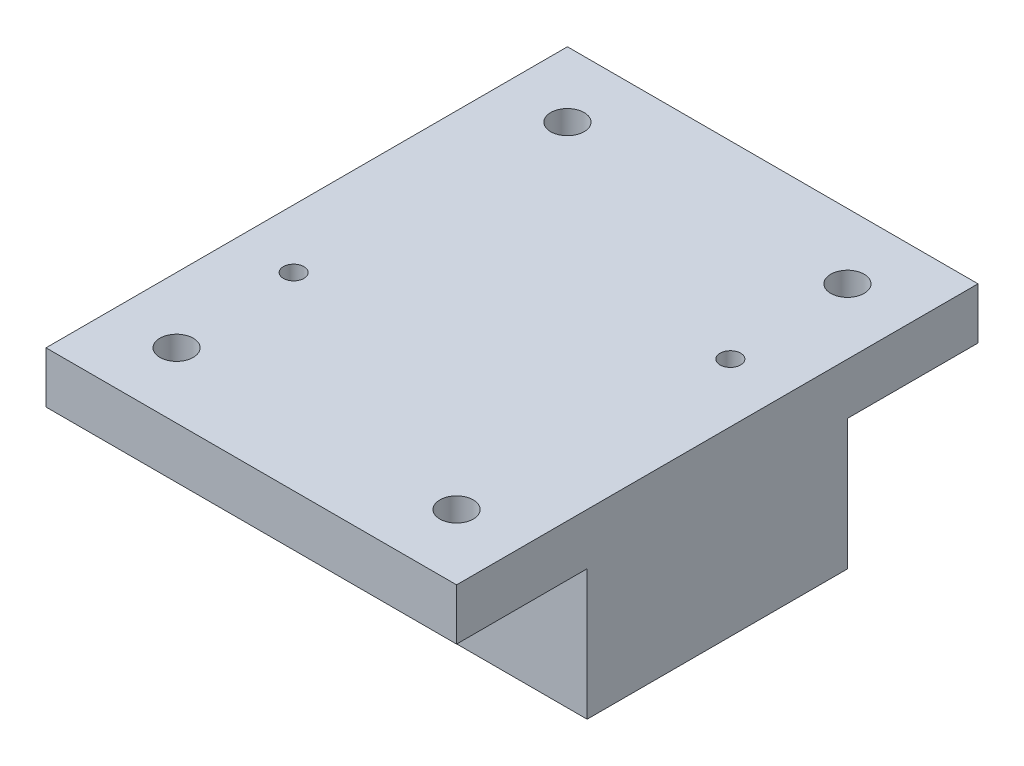
ISO-10303-21;
HEADER;
FILE_DESCRIPTION(('STEP AP214'),'2;1');
FILE_NAME('part.step','',(''),(''),'','','');
FILE_SCHEMA(('AUTOMOTIVE_DESIGN { 1 0 10303 214 1 1 1 1 }'));
ENDSEC;
DATA;
#1=APPLICATION_CONTEXT('core data for automotive mechanical design processes');
#2=APPLICATION_PROTOCOL_DEFINITION('international standard','automotive_design',2000,#1);
#3=PRODUCT_CONTEXT('',#1,'mechanical');
#4=PRODUCT('Part','Part','',(#3));
#5=PRODUCT_RELATED_PRODUCT_CATEGORY('part','',(#4));
#6=PRODUCT_DEFINITION_FORMATION('','',#4);
#7=PRODUCT_DEFINITION_CONTEXT('part definition',#1,'design');
#8=PRODUCT_DEFINITION('design','',#6,#7);
#9=PRODUCT_DEFINITION_SHAPE('','',#8);
#10=(LENGTH_UNIT() NAMED_UNIT(*) SI_UNIT(.MILLI.,.METRE.));
#11=(NAMED_UNIT(*) PLANE_ANGLE_UNIT() SI_UNIT($,.RADIAN.));
#12=(NAMED_UNIT(*) SI_UNIT($,.STERADIAN.) SOLID_ANGLE_UNIT());
#13=UNCERTAINTY_MEASURE_WITH_UNIT(LENGTH_MEASURE(1.E-05),#10,'distance_accuracy_value','');
#14=(GEOMETRIC_REPRESENTATION_CONTEXT(3) GLOBAL_UNCERTAINTY_ASSIGNED_CONTEXT((#13)) GLOBAL_UNIT_ASSIGNED_CONTEXT((#10,
#11,#12)) REPRESENTATION_CONTEXT('',''));
#15=CARTESIAN_POINT('',(0.,0.,0.));
#16=DIRECTION('',(0.,0.,1.));
#17=DIRECTION('',(1.,0.,0.));
#18=AXIS2_PLACEMENT_3D('',#15,#16,#17);
#19=CARTESIAN_POINT('',(0.,0.,0.));
#20=DIRECTION('',(0.,1.,0.));
#21=DIRECTION('',(0.,0.,1.));
#22=AXIS2_PLACEMENT_3D('',#19,#20,#21);
#23=PLANE('',#22);
#24=CARTESIAN_POINT('',(-27.28125,0.,-38.08125));
#25=DIRECTION('',(0.,1.,0.));
#26=DIRECTION('',(0.,0.,1.));
#27=AXIS2_PLACEMENT_3D('',#24,#25,#26);
#28=CIRCLE('',#27,3.25);
#29=CARTESIAN_POINT('',(-27.28125,0.,-34.83125));
#30=VERTEX_POINT('',#29);
#31=EDGE_CURVE('E176',#30,#30,#28,.T.);
#32=ORIENTED_EDGE('',*,*,#31,.T.);
#33=EDGE_LOOP('',(#32));
#34=FACE_BOUND('',#33,.T.);
#35=CARTESIAN_POINT('',(27.28125,0.,-38.08125));
#36=DIRECTION('',(0.,1.,0.));
#37=DIRECTION('',(0.,0.,1.));
#38=AXIS2_PLACEMENT_3D('',#35,#36,#37);
#39=CIRCLE('',#38,3.25);
#40=CARTESIAN_POINT('',(27.28125,0.,-34.83125));
#41=VERTEX_POINT('',#40);
#42=EDGE_CURVE('E173',#41,#41,#39,.T.);
#43=ORIENTED_EDGE('',*,*,#42,.T.);
#44=EDGE_LOOP('',(#43));
#45=FACE_BOUND('',#44,.T.);
#46=DIRECTION('',(1.,0.,0.));
#47=VECTOR('',#46,1.);
#48=CARTESIAN_POINT('',(0.,0.,-25.3625));
#49=LINE('',#48,#47);
#50=CARTESIAN_POINT('',(-40.,0.,-25.3625));
#51=VERTEX_POINT('',#50);
#52=CARTESIAN_POINT('',(40.,0.,-25.3625));
#53=VERTEX_POINT('',#52);
#54=EDGE_CURVE('E58',#51,#53,#49,.T.);
#55=ORIENTED_EDGE('',*,*,#54,.F.);
#56=DIRECTION('',(0.,0.,-1.));
#57=VECTOR('',#56,1.);
#58=CARTESIAN_POINT('',(-40.,0.,0.));
#59=LINE('',#58,#57);
#60=CARTESIAN_POINT('',(-40.,0.,-50.8));
#61=VERTEX_POINT('',#60);
#62=EDGE_CURVE('E135',#51,#61,#59,.T.);
#63=ORIENTED_EDGE('',*,*,#62,.T.);
#64=DIRECTION('',(1.,0.,0.));
#65=VECTOR('',#64,1.);
#66=CARTESIAN_POINT('',(0.,0.,-50.8));
#67=LINE('',#66,#65);
#68=CARTESIAN_POINT('',(40.,0.,-50.8));
#69=VERTEX_POINT('',#68);
#70=EDGE_CURVE('E170',#61,#69,#67,.T.);
#71=ORIENTED_EDGE('',*,*,#70,.T.);
#72=DIRECTION('',(0.,0.,-1.));
#73=VECTOR('',#72,1.);
#74=CARTESIAN_POINT('',(40.,0.,0.));
#75=LINE('',#74,#73);
#76=EDGE_CURVE('E168',#53,#69,#75,.T.);
#77=ORIENTED_EDGE('',*,*,#76,.F.);
#78=EDGE_LOOP('',(#55,#63,#71,#77));
#79=FACE_BOUND('',#78,.T.);
#80=ADVANCED_FACE('F35',(#34,#45,#79),#23,.F.);
#81=CARTESIAN_POINT('',(-40.,10.,0.));
#82=DIRECTION('',(-1.,0.,0.));
#83=DIRECTION('',(0.,0.,1.));
#84=AXIS2_PLACEMENT_3D('',#81,#82,#83);
#85=PLANE('',#84);
#86=CARTESIAN_POINT('',(-40.,0.,50.8));
#87=VERTEX_POINT('',#86);
#88=CARTESIAN_POINT('',(-40.,0.,25.3625));
#89=VERTEX_POINT('',#88);
#90=EDGE_CURVE('E164',#87,#89,#59,.T.);
#91=ORIENTED_EDGE('',*,*,#90,.F.);
#92=DIRECTION('',(0.,-1.,0.));
#93=VECTOR('',#92,1.);
#94=CARTESIAN_POINT('',(-40.,10.,50.8));
#95=LINE('',#94,#93);
#96=CARTESIAN_POINT('',(-40.,10.,50.8));
#97=VERTEX_POINT('',#96);
#98=EDGE_CURVE('E11',#97,#87,#95,.T.);
#99=ORIENTED_EDGE('',*,*,#98,.F.);
#100=DIRECTION('',(0.,0.,-1.));
#101=VECTOR('',#100,1.);
#102=CARTESIAN_POINT('',(-40.,10.,0.));
#103=LINE('',#102,#101);
#104=CARTESIAN_POINT('',(-40.,10.,-50.8));
#105=VERTEX_POINT('',#104);
#106=EDGE_CURVE('E140',#97,#105,#103,.T.);
#107=ORIENTED_EDGE('',*,*,#106,.T.);
#108=DIRECTION('',(0.,-1.,0.));
#109=VECTOR('',#108,1.);
#110=CARTESIAN_POINT('',(-40.,10.,-50.8));
#111=LINE('',#110,#109);
#112=EDGE_CURVE('E163',#105,#61,#111,.T.);
#113=ORIENTED_EDGE('',*,*,#112,.T.);
#114=ORIENTED_EDGE('',*,*,#62,.F.);
#115=DIRECTION('',(0.,1.,0.));
#116=VECTOR('',#115,1.);
#117=CARTESIAN_POINT('',(-40.,-25.4,-25.3625));
#118=LINE('',#117,#116);
#119=CARTESIAN_POINT('',(-40.,-25.4,-25.3625));
#120=VERTEX_POINT('',#119);
#121=EDGE_CURVE('E136',#120,#51,#118,.T.);
#122=ORIENTED_EDGE('',*,*,#121,.F.);
#123=DIRECTION('',(0.,0.,-1.));
#124=VECTOR('',#123,1.);
#125=CARTESIAN_POINT('',(-40.,-25.4,0.));
#126=LINE('',#125,#124);
#127=CARTESIAN_POINT('',(-40.,-25.4,25.3625));
#128=VERTEX_POINT('',#127);
#129=EDGE_CURVE('E110',#128,#120,#126,.T.);
#130=ORIENTED_EDGE('',*,*,#129,.F.);
#131=DIRECTION('',(0.,1.,0.));
#132=VECTOR('',#131,1.);
#133=CARTESIAN_POINT('',(-40.,-25.4,25.3625));
#134=LINE('',#133,#132);
#135=EDGE_CURVE('E122',#128,#89,#134,.T.);
#136=ORIENTED_EDGE('',*,*,#135,.T.);
#137=EDGE_LOOP('',(#91,#99,#107,#113,#114,#122,#130,#136));
#138=FACE_BOUND('',#137,.T.);
#139=ADVANCED_FACE('F37',(#138),#85,.T.);
#140=CARTESIAN_POINT('',(0.,10.,50.8));
#141=DIRECTION('',(0.,0.,-1.));
#142=DIRECTION('',(-1.,0.,0.));
#143=AXIS2_PLACEMENT_3D('',#140,#141,#142);
#144=PLANE('',#143);
#145=DIRECTION('',(1.,0.,0.));
#146=VECTOR('',#145,1.);
#147=CARTESIAN_POINT('',(0.,0.,50.8));
#148=LINE('',#147,#146);
#149=CARTESIAN_POINT('',(40.,0.,50.8));
#150=VERTEX_POINT('',#149);
#151=EDGE_CURVE('E166',#87,#150,#148,.T.);
#152=ORIENTED_EDGE('',*,*,#151,.T.);
#153=DIRECTION('',(0.,-1.,0.));
#154=VECTOR('',#153,1.);
#155=CARTESIAN_POINT('',(40.,10.,50.8));
#156=LINE('',#155,#154);
#157=CARTESIAN_POINT('',(40.,10.,50.8));
#158=VERTEX_POINT('',#157);
#159=EDGE_CURVE('E43',#158,#150,#156,.T.);
#160=ORIENTED_EDGE('',*,*,#159,.F.);
#161=DIRECTION('',(1.,0.,0.));
#162=VECTOR('',#161,1.);
#163=CARTESIAN_POINT('',(0.,10.,50.8));
#164=LINE('',#163,#162);
#165=EDGE_CURVE('E143',#97,#158,#164,.T.);
#166=ORIENTED_EDGE('',*,*,#165,.F.);
#167=ORIENTED_EDGE('',*,*,#98,.T.);
#168=EDGE_LOOP('',(#152,#160,#166,#167));
#169=FACE_BOUND('',#168,.T.);
#170=ADVANCED_FACE('F209',(#169),#144,.F.);
#171=CARTESIAN_POINT('',(40.,10.,0.));
#172=DIRECTION('',(-1.,0.,0.));
#173=DIRECTION('',(0.,0.,1.));
#174=AXIS2_PLACEMENT_3D('',#171,#172,#173);
#175=PLANE('',#174);
#176=CARTESIAN_POINT('',(40.,0.,25.3625));
#177=VERTEX_POINT('',#176);
#178=EDGE_CURVE('E106',#150,#177,#75,.T.);
#179=ORIENTED_EDGE('',*,*,#178,.T.);
#180=DIRECTION('',(0.,1.,0.));
#181=VECTOR('',#180,1.);
#182=CARTESIAN_POINT('',(40.,-25.4,25.3625));
#183=LINE('',#182,#181);
#184=CARTESIAN_POINT('',(40.,-25.4,25.3625));
#185=VERTEX_POINT('',#184);
#186=EDGE_CURVE('E100',#185,#177,#183,.T.);
#187=ORIENTED_EDGE('',*,*,#186,.F.);
#188=DIRECTION('',(0.,0.,-1.));
#189=VECTOR('',#188,1.);
#190=CARTESIAN_POINT('',(40.,-25.4,0.));
#191=LINE('',#190,#189);
#192=CARTESIAN_POINT('',(40.,-25.4,-25.3625));
#193=VERTEX_POINT('',#192);
#194=EDGE_CURVE('E104',#185,#193,#191,.T.);
#195=ORIENTED_EDGE('',*,*,#194,.T.);
#196=DIRECTION('',(0.,1.,0.));
#197=VECTOR('',#196,1.);
#198=CARTESIAN_POINT('',(40.,-25.4,-25.3625));
#199=LINE('',#198,#197);
#200=EDGE_CURVE('E109',#193,#53,#199,.T.);
#201=ORIENTED_EDGE('',*,*,#200,.T.);
#202=ORIENTED_EDGE('',*,*,#76,.T.);
#203=DIRECTION('',(0.,-1.,0.));
#204=VECTOR('',#203,1.);
#205=CARTESIAN_POINT('',(40.,10.,-50.8));
#206=LINE('',#205,#204);
#207=CARTESIAN_POINT('',(40.,10.,-50.8));
#208=VERTEX_POINT('',#207);
#209=EDGE_CURVE('E186',#208,#69,#206,.T.);
#210=ORIENTED_EDGE('',*,*,#209,.F.);
#211=DIRECTION('',(0.,0.,-1.));
#212=VECTOR('',#211,1.);
#213=CARTESIAN_POINT('',(40.,10.,0.));
#214=LINE('',#213,#212);
#215=EDGE_CURVE('E146',#158,#208,#214,.T.);
#216=ORIENTED_EDGE('',*,*,#215,.F.);
#217=ORIENTED_EDGE('',*,*,#159,.T.);
#218=EDGE_LOOP('',(#179,#187,#195,#201,#202,#210,#216,#217));
#219=FACE_BOUND('',#218,.T.);
#220=ADVANCED_FACE('F102',(#219),#175,.F.);
#221=CARTESIAN_POINT('',(27.28125,10.,38.08125));
#222=DIRECTION('',(0.,-1.,0.));
#223=DIRECTION('',(0.,0.,-1.));
#224=AXIS2_PLACEMENT_3D('',#221,#222,#223);
#225=CYLINDRICAL_SURFACE('',#224,3.25);
#226=CARTESIAN_POINT('',(27.28125,10.,38.08125));
#227=DIRECTION('',(0.,1.,0.));
#228=DIRECTION('',(0.,0.,1.));
#229=AXIS2_PLACEMENT_3D('',#226,#227,#228);
#230=CIRCLE('',#229,3.25);
#231=CARTESIAN_POINT('',(27.28125,10.,41.33125));
#232=VERTEX_POINT('',#231);
#233=EDGE_CURVE('E157',#232,#232,#230,.T.);
#234=ORIENTED_EDGE('',*,*,#233,.T.);
#235=EDGE_LOOP('',(#234));
#236=FACE_BOUND('',#235,.T.);
#237=CARTESIAN_POINT('',(27.28125,0.,38.08125));
#238=DIRECTION('',(0.,1.,0.));
#239=DIRECTION('',(0.,0.,1.));
#240=AXIS2_PLACEMENT_3D('',#237,#238,#239);
#241=CIRCLE('',#240,3.25);
#242=CARTESIAN_POINT('',(27.28125,0.,41.33125));
#243=VERTEX_POINT('',#242);
#244=EDGE_CURVE('E179',#243,#243,#241,.T.);
#245=ORIENTED_EDGE('',*,*,#244,.F.);
#246=EDGE_LOOP('',(#245));
#247=FACE_BOUND('',#246,.T.);
#248=ADVANCED_FACE('F215',(#236,#247),#225,.F.);
#249=CARTESIAN_POINT('',(-27.28125,10.,-38.08125));
#250=DIRECTION('',(0.,-1.,0.));
#251=DIRECTION('',(0.,0.,-1.));
#252=AXIS2_PLACEMENT_3D('',#249,#250,#251);
#253=CYLINDRICAL_SURFACE('',#252,3.25);
#254=CARTESIAN_POINT('',(-27.28125,10.,-38.08125));
#255=DIRECTION('',(0.,1.,0.));
#256=DIRECTION('',(0.,0.,1.));
#257=AXIS2_PLACEMENT_3D('',#254,#255,#256);
#258=CIRCLE('',#257,3.25);
#259=CARTESIAN_POINT('',(-27.28125,10.,-34.83125));
#260=VERTEX_POINT('',#259);
#261=EDGE_CURVE('E154',#260,#260,#258,.T.);
#262=ORIENTED_EDGE('',*,*,#261,.T.);
#263=EDGE_LOOP('',(#262));
#264=FACE_BOUND('',#263,.T.);
#265=ORIENTED_EDGE('',*,*,#31,.F.);
#266=EDGE_LOOP('',(#265));
#267=FACE_BOUND('',#266,.T.);
#268=ADVANCED_FACE('F335',(#264,#267),#253,.F.);
#269=CARTESIAN_POINT('',(27.28125,10.,-38.08125));
#270=DIRECTION('',(0.,-1.,0.));
#271=DIRECTION('',(0.,0.,-1.));
#272=AXIS2_PLACEMENT_3D('',#269,#270,#271);
#273=CYLINDRICAL_SURFACE('',#272,3.25);
#274=CARTESIAN_POINT('',(27.28125,10.,-38.08125));
#275=DIRECTION('',(0.,1.,0.));
#276=DIRECTION('',(0.,0.,1.));
#277=AXIS2_PLACEMENT_3D('',#274,#275,#276);
#278=CIRCLE('',#277,3.25);
#279=CARTESIAN_POINT('',(27.28125,10.,-34.83125));
#280=VERTEX_POINT('',#279);
#281=EDGE_CURVE('E151',#280,#280,#278,.T.);
#282=ORIENTED_EDGE('',*,*,#281,.T.);
#283=EDGE_LOOP('',(#282));
#284=FACE_BOUND('',#283,.T.);
#285=ORIENTED_EDGE('',*,*,#42,.F.);
#286=EDGE_LOOP('',(#285));
#287=FACE_BOUND('',#286,.T.);
#288=ADVANCED_FACE('F326',(#284,#287),#273,.F.);
#289=CARTESIAN_POINT('',(0.,10.,-50.8));
#290=DIRECTION('',(0.,0.,-1.));
#291=DIRECTION('',(-1.,0.,0.));
#292=AXIS2_PLACEMENT_3D('',#289,#290,#291);
#293=PLANE('',#292);
#294=ORIENTED_EDGE('',*,*,#70,.F.);
#295=ORIENTED_EDGE('',*,*,#112,.F.);
#296=DIRECTION('',(1.,0.,0.));
#297=VECTOR('',#296,1.);
#298=CARTESIAN_POINT('',(0.,10.,-50.8));
#299=LINE('',#298,#297);
#300=EDGE_CURVE('E148',#105,#208,#299,.T.);
#301=ORIENTED_EDGE('',*,*,#300,.T.);
#302=ORIENTED_EDGE('',*,*,#209,.T.);
#303=EDGE_LOOP('',(#294,#295,#301,#302));
#304=FACE_BOUND('',#303,.T.);
#305=ADVANCED_FACE('F203',(#304),#293,.T.);
#306=CARTESIAN_POINT('',(-27.28125,10.,38.08125));
#307=DIRECTION('',(0.,-1.,0.));
#308=DIRECTION('',(0.,0.,-1.));
#309=AXIS2_PLACEMENT_3D('',#306,#307,#308);
#310=CYLINDRICAL_SURFACE('',#309,3.25);
#311=CARTESIAN_POINT('',(-27.28125,10.,38.08125));
#312=DIRECTION('',(0.,1.,0.));
#313=DIRECTION('',(0.,0.,1.));
#314=AXIS2_PLACEMENT_3D('',#311,#312,#313);
#315=CIRCLE('',#314,3.25);
#316=CARTESIAN_POINT('',(-27.28125,10.,41.33125));
#317=VERTEX_POINT('',#316);
#318=EDGE_CURVE('E160',#317,#317,#315,.T.);
#319=ORIENTED_EDGE('',*,*,#318,.T.);
#320=EDGE_LOOP('',(#319));
#321=FACE_BOUND('',#320,.T.);
#322=CARTESIAN_POINT('',(-27.28125,0.,38.08125));
#323=DIRECTION('',(0.,1.,0.));
#324=DIRECTION('',(0.,0.,1.));
#325=AXIS2_PLACEMENT_3D('',#322,#323,#324);
#326=CIRCLE('',#325,3.25);
#327=CARTESIAN_POINT('',(-27.28125,0.,41.33125));
#328=VERTEX_POINT('',#327);
#329=EDGE_CURVE('E144',#328,#328,#326,.T.);
#330=ORIENTED_EDGE('',*,*,#329,.F.);
#331=EDGE_LOOP('',(#330));
#332=FACE_BOUND('',#331,.T.);
#333=ADVANCED_FACE('F231',(#321,#332),#310,.F.);
#334=CARTESIAN_POINT('',(0.,10.,0.));
#335=DIRECTION('',(0.,1.,0.));
#336=DIRECTION('',(0.,0.,1.));
#337=AXIS2_PLACEMENT_3D('',#334,#335,#336);
#338=PLANE('',#337);
#339=CARTESIAN_POINT('',(-28.575,10.,13.97));
#340=DIRECTION('',(0.,1.,0.));
#341=DIRECTION('',(0.,0.,1.));
#342=AXIS2_PLACEMENT_3D('',#339,#340,#341);
#343=CIRCLE('',#342,2.);
#344=CARTESIAN_POINT('',(-28.575,10.,15.97));
#345=VERTEX_POINT('',#344);
#346=EDGE_CURVE('E258',#345,#345,#343,.T.);
#347=ORIENTED_EDGE('',*,*,#346,.F.);
#348=EDGE_LOOP('',(#347));
#349=FACE_BOUND('',#348,.T.);
#350=CARTESIAN_POINT('',(28.575,10.,-13.97));
#351=DIRECTION('',(0.,1.,0.));
#352=DIRECTION('',(0.,0.,1.));
#353=AXIS2_PLACEMENT_3D('',#350,#351,#352);
#354=CIRCLE('',#353,2.);
#355=CARTESIAN_POINT('',(28.575,10.,-11.97));
#356=VERTEX_POINT('',#355);
#357=EDGE_CURVE('E127',#356,#356,#354,.T.);
#358=ORIENTED_EDGE('',*,*,#357,.F.);
#359=EDGE_LOOP('',(#358));
#360=FACE_BOUND('',#359,.T.);
#361=ORIENTED_EDGE('',*,*,#106,.F.);
#362=ORIENTED_EDGE('',*,*,#165,.T.);
#363=ORIENTED_EDGE('',*,*,#215,.T.);
#364=ORIENTED_EDGE('',*,*,#300,.F.);
#365=EDGE_LOOP('',(#361,#362,#363,#364));
#366=FACE_BOUND('',#365,.T.);
#367=ORIENTED_EDGE('',*,*,#281,.F.);
#368=EDGE_LOOP('',(#367));
#369=FACE_BOUND('',#368,.T.);
#370=ORIENTED_EDGE('',*,*,#261,.F.);
#371=EDGE_LOOP('',(#370));
#372=FACE_BOUND('',#371,.T.);
#373=ORIENTED_EDGE('',*,*,#233,.F.);
#374=EDGE_LOOP('',(#373));
#375=FACE_BOUND('',#374,.T.);
#376=ORIENTED_EDGE('',*,*,#318,.F.);
#377=EDGE_LOOP('',(#376));
#378=FACE_BOUND('',#377,.T.);
#379=ADVANCED_FACE('F207',(#349,#360,#366,#369,#372,#375,#378),#338,.T.);
#380=ORIENTED_EDGE('',*,*,#90,.T.);
#381=DIRECTION('',(1.,0.,0.));
#382=VECTOR('',#381,1.);
#383=CARTESIAN_POINT('',(0.,0.,25.3625));
#384=LINE('',#383,#382);
#385=EDGE_CURVE('E50',#89,#177,#384,.T.);
#386=ORIENTED_EDGE('',*,*,#385,.T.);
#387=ORIENTED_EDGE('',*,*,#178,.F.);
#388=ORIENTED_EDGE('',*,*,#151,.F.);
#389=EDGE_LOOP('',(#380,#386,#387,#388));
#390=FACE_BOUND('',#389,.T.);
#391=ORIENTED_EDGE('',*,*,#244,.T.);
#392=EDGE_LOOP('',(#391));
#393=FACE_BOUND('',#392,.T.);
#394=ORIENTED_EDGE('',*,*,#329,.T.);
#395=EDGE_LOOP('',(#394));
#396=FACE_BOUND('',#395,.T.);
#397=ADVANCED_FACE('F194',(#390,#393,#396),#23,.F.);
#398=CARTESIAN_POINT('',(0.,-25.4,25.3625));
#399=DIRECTION('',(0.,0.,1.));
#400=DIRECTION('',(1.,0.,0.));
#401=AXIS2_PLACEMENT_3D('',#398,#399,#400);
#402=PLANE('',#401);
#403=ORIENTED_EDGE('',*,*,#385,.F.);
#404=ORIENTED_EDGE('',*,*,#135,.F.);
#405=DIRECTION('',(1.,0.,0.));
#406=VECTOR('',#405,1.);
#407=CARTESIAN_POINT('',(0.,-25.4,25.3625));
#408=LINE('',#407,#406);
#409=EDGE_CURVE('E115',#128,#185,#408,.T.);
#410=ORIENTED_EDGE('',*,*,#409,.T.);
#411=ORIENTED_EDGE('',*,*,#186,.T.);
#412=EDGE_LOOP('',(#403,#404,#410,#411));
#413=FACE_BOUND('',#412,.T.);
#414=ADVANCED_FACE('F120',(#413),#402,.T.);
#415=CARTESIAN_POINT('',(0.,-25.4,-25.3625));
#416=DIRECTION('',(0.,0.,1.));
#417=DIRECTION('',(1.,0.,0.));
#418=AXIS2_PLACEMENT_3D('',#415,#416,#417);
#419=PLANE('',#418);
#420=ORIENTED_EDGE('',*,*,#54,.T.);
#421=ORIENTED_EDGE('',*,*,#200,.F.);
#422=DIRECTION('',(1.,0.,0.));
#423=VECTOR('',#422,1.);
#424=CARTESIAN_POINT('',(0.,-25.4,-25.3625));
#425=LINE('',#424,#423);
#426=EDGE_CURVE('E117',#120,#193,#425,.T.);
#427=ORIENTED_EDGE('',*,*,#426,.F.);
#428=ORIENTED_EDGE('',*,*,#121,.T.);
#429=EDGE_LOOP('',(#420,#421,#427,#428));
#430=FACE_BOUND('',#429,.T.);
#431=ADVANCED_FACE('F200',(#430),#419,.F.);
#432=CARTESIAN_POINT('',(0.,-25.4,0.));
#433=DIRECTION('',(0.,1.,0.));
#434=DIRECTION('',(0.,0.,1.));
#435=AXIS2_PLACEMENT_3D('',#432,#433,#434);
#436=PLANE('',#435);
#437=CARTESIAN_POINT('',(-28.575,-25.4,13.97));
#438=DIRECTION('',(0.,1.,0.));
#439=DIRECTION('',(0.,0.,1.));
#440=AXIS2_PLACEMENT_3D('',#437,#438,#439);
#441=CIRCLE('',#440,2.);
#442=CARTESIAN_POINT('',(-28.575,-25.4,15.97));
#443=VERTEX_POINT('',#442);
#444=EDGE_CURVE('E132',#443,#443,#441,.T.);
#445=ORIENTED_EDGE('',*,*,#444,.T.);
#446=EDGE_LOOP('',(#445));
#447=FACE_BOUND('',#446,.T.);
#448=CARTESIAN_POINT('',(28.575,-25.4,-13.97));
#449=DIRECTION('',(0.,1.,0.));
#450=DIRECTION('',(0.,0.,1.));
#451=AXIS2_PLACEMENT_3D('',#448,#449,#450);
#452=CIRCLE('',#451,2.);
#453=CARTESIAN_POINT('',(28.575,-25.4,-11.97));
#454=VERTEX_POINT('',#453);
#455=EDGE_CURVE('E259',#454,#454,#452,.T.);
#456=ORIENTED_EDGE('',*,*,#455,.T.);
#457=EDGE_LOOP('',(#456));
#458=FACE_BOUND('',#457,.T.);
#459=ORIENTED_EDGE('',*,*,#409,.F.);
#460=ORIENTED_EDGE('',*,*,#129,.T.);
#461=ORIENTED_EDGE('',*,*,#426,.T.);
#462=ORIENTED_EDGE('',*,*,#194,.F.);
#463=EDGE_LOOP('',(#459,#460,#461,#462));
#464=FACE_BOUND('',#463,.T.);
#465=ADVANCED_FACE('F114',(#447,#458,#464),#436,.F.);
#466=CARTESIAN_POINT('',(28.575,-25.4,-13.97));
#467=DIRECTION('',(0.,1.,0.));
#468=DIRECTION('',(0.,0.,1.));
#469=AXIS2_PLACEMENT_3D('',#466,#467,#468);
#470=CYLINDRICAL_SURFACE('',#469,2.);
#471=ORIENTED_EDGE('',*,*,#455,.F.);
#472=EDGE_LOOP('',(#471));
#473=FACE_BOUND('',#472,.T.);
#474=ORIENTED_EDGE('',*,*,#357,.T.);
#475=EDGE_LOOP('',(#474));
#476=FACE_BOUND('',#475,.T.);
#477=ADVANCED_FACE('F244',(#473,#476),#470,.F.);
#478=CARTESIAN_POINT('',(-28.575,-25.4,13.97));
#479=DIRECTION('',(0.,1.,0.));
#480=DIRECTION('',(0.,0.,1.));
#481=AXIS2_PLACEMENT_3D('',#478,#479,#480);
#482=CYLINDRICAL_SURFACE('',#481,2.);
#483=ORIENTED_EDGE('',*,*,#444,.F.);
#484=EDGE_LOOP('',(#483));
#485=FACE_BOUND('',#484,.T.);
#486=ORIENTED_EDGE('',*,*,#346,.T.);
#487=EDGE_LOOP('',(#486));
#488=FACE_BOUND('',#487,.T.);
#489=ADVANCED_FACE('F248',(#485,#488),#482,.F.);
#490=CLOSED_SHELL('',(#80,#139,#170,#220,#248,#268,#288,#305,#333,#379,#397,#414,#431,#465,#477,#489));
#491=MANIFOLD_SOLID_BREP('B2',#490);
#492=ADVANCED_BREP_SHAPE_REPRESENTATION('',(#18,#491),#14);
#493=SHAPE_DEFINITION_REPRESENTATION(#9,#492);
ENDSEC;
END-ISO-10303-21;
